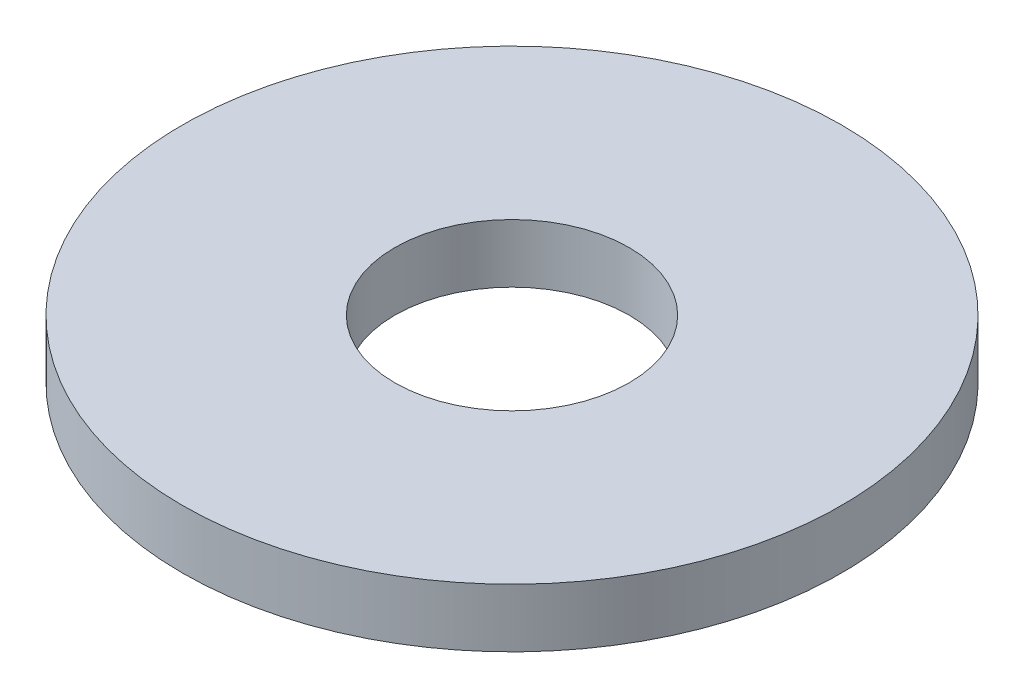
ISO-10303-21;
HEADER;
FILE_DESCRIPTION(('STEP AP214'),'2;1');
FILE_NAME('part.step','',(''),(''),'','','');
FILE_SCHEMA(('AUTOMOTIVE_DESIGN { 1 0 10303 214 1 1 1 1 }'));
ENDSEC;
DATA;
#1=APPLICATION_CONTEXT('core data for automotive mechanical design processes');
#2=APPLICATION_PROTOCOL_DEFINITION('international standard','automotive_design',2000,#1);
#3=PRODUCT_CONTEXT('',#1,'mechanical');
#4=PRODUCT('Part','Part','',(#3));
#5=PRODUCT_RELATED_PRODUCT_CATEGORY('part','',(#4));
#6=PRODUCT_DEFINITION_FORMATION('','',#4);
#7=PRODUCT_DEFINITION_CONTEXT('part definition',#1,'design');
#8=PRODUCT_DEFINITION('design','',#6,#7);
#9=PRODUCT_DEFINITION_SHAPE('','',#8);
#10=(LENGTH_UNIT() NAMED_UNIT(*) SI_UNIT(.MILLI.,.METRE.));
#11=(NAMED_UNIT(*) PLANE_ANGLE_UNIT() SI_UNIT($,.RADIAN.));
#12=(NAMED_UNIT(*) SI_UNIT($,.STERADIAN.) SOLID_ANGLE_UNIT());
#13=UNCERTAINTY_MEASURE_WITH_UNIT(LENGTH_MEASURE(1.E-05),#10,'distance_accuracy_value','');
#14=(GEOMETRIC_REPRESENTATION_CONTEXT(3) GLOBAL_UNCERTAINTY_ASSIGNED_CONTEXT((#13)) GLOBAL_UNIT_ASSIGNED_CONTEXT((#10,
#11,#12)) REPRESENTATION_CONTEXT('',''));
#15=CARTESIAN_POINT('',(0.,0.,0.));
#16=DIRECTION('',(0.,0.,1.));
#17=DIRECTION('',(1.,0.,0.));
#18=AXIS2_PLACEMENT_3D('',#15,#16,#17);
#19=CARTESIAN_POINT('',(0.,1.6,0.));
#20=DIRECTION('',(0.,1.,0.));
#21=DIRECTION('',(0.,0.,1.));
#22=AXIS2_PLACEMENT_3D('',#19,#20,#21);
#23=PLANE('',#22);
#24=CARTESIAN_POINT('',(0.,1.6,0.));
#25=DIRECTION('',(0.,1.,0.));
#26=DIRECTION('',(0.,0.,1.));
#27=AXIS2_PLACEMENT_3D('',#24,#25,#26);
#28=CIRCLE('',#27,9.);
#29=CARTESIAN_POINT('',(0.,1.6,9.));
#30=VERTEX_POINT('',#29);
#31=EDGE_CURVE('E10',#30,#30,#28,.T.);
#32=ORIENTED_EDGE('',*,*,#31,.T.);
#33=EDGE_LOOP('',(#32));
#34=FACE_BOUND('',#33,.T.);
#35=CARTESIAN_POINT('',(0.,1.6,0.));
#36=DIRECTION('',(0.,1.,0.));
#37=DIRECTION('',(0.,0.,1.));
#38=AXIS2_PLACEMENT_3D('',#35,#36,#37);
#39=CIRCLE('',#38,3.2);
#40=CARTESIAN_POINT('',(0.,1.6,3.2));
#41=VERTEX_POINT('',#40);
#42=EDGE_CURVE('E41',#41,#41,#39,.T.);
#43=ORIENTED_EDGE('',*,*,#42,.F.);
#44=EDGE_LOOP('',(#43));
#45=FACE_BOUND('',#44,.T.);
#46=ADVANCED_FACE('F30',(#34,#45),#23,.T.);
#47=CARTESIAN_POINT('',(0.,0.,0.));
#48=DIRECTION('',(0.,1.,0.));
#49=DIRECTION('',(0.,0.,1.));
#50=AXIS2_PLACEMENT_3D('',#47,#48,#49);
#51=PLANE('',#50);
#52=CARTESIAN_POINT('',(0.,0.,0.));
#53=DIRECTION('',(0.,1.,0.));
#54=DIRECTION('',(0.,0.,1.));
#55=AXIS2_PLACEMENT_3D('',#52,#53,#54);
#56=CIRCLE('',#55,9.);
#57=CARTESIAN_POINT('',(0.,0.,9.));
#58=VERTEX_POINT('',#57);
#59=EDGE_CURVE('E34',#58,#58,#56,.T.);
#60=ORIENTED_EDGE('',*,*,#59,.F.);
#61=EDGE_LOOP('',(#60));
#62=FACE_BOUND('',#61,.T.);
#63=CARTESIAN_POINT('',(0.,0.,0.));
#64=DIRECTION('',(0.,1.,0.));
#65=DIRECTION('',(0.,0.,1.));
#66=AXIS2_PLACEMENT_3D('',#63,#64,#65);
#67=CIRCLE('',#66,3.2);
#68=CARTESIAN_POINT('',(0.,0.,3.2));
#69=VERTEX_POINT('',#68);
#70=EDGE_CURVE('E43',#69,#69,#67,.T.);
#71=ORIENTED_EDGE('',*,*,#70,.T.);
#72=EDGE_LOOP('',(#71));
#73=FACE_BOUND('',#72,.T.);
#74=ADVANCED_FACE('F53',(#62,#73),#51,.F.);
#75=CARTESIAN_POINT('',(0.,1.6,0.));
#76=DIRECTION('',(0.,-1.,0.));
#77=DIRECTION('',(0.,0.,-1.));
#78=AXIS2_PLACEMENT_3D('',#75,#76,#77);
#79=CYLINDRICAL_SURFACE('',#78,9.);
#80=ORIENTED_EDGE('',*,*,#31,.F.);
#81=EDGE_LOOP('',(#80));
#82=FACE_BOUND('',#81,.T.);
#83=ORIENTED_EDGE('',*,*,#59,.T.);
#84=EDGE_LOOP('',(#83));
#85=FACE_BOUND('',#84,.T.);
#86=ADVANCED_FACE('F32',(#82,#85),#79,.T.);
#87=CARTESIAN_POINT('',(0.,1.6,0.));
#88=DIRECTION('',(0.,-1.,0.));
#89=DIRECTION('',(0.,0.,-1.));
#90=AXIS2_PLACEMENT_3D('',#87,#88,#89);
#91=CYLINDRICAL_SURFACE('',#90,3.2);
#92=ORIENTED_EDGE('',*,*,#42,.T.);
#93=EDGE_LOOP('',(#92));
#94=FACE_BOUND('',#93,.T.);
#95=ORIENTED_EDGE('',*,*,#70,.F.);
#96=EDGE_LOOP('',(#95));
#97=FACE_BOUND('',#96,.T.);
#98=ADVANCED_FACE('F49',(#94,#97),#91,.F.);
#99=CLOSED_SHELL('',(#46,#74,#86,#98));
#100=MANIFOLD_SOLID_BREP('B2',#99);
#101=ADVANCED_BREP_SHAPE_REPRESENTATION('',(#18,#100),#14);
#102=SHAPE_DEFINITION_REPRESENTATION(#9,#101);
ENDSEC;
END-ISO-10303-21;
